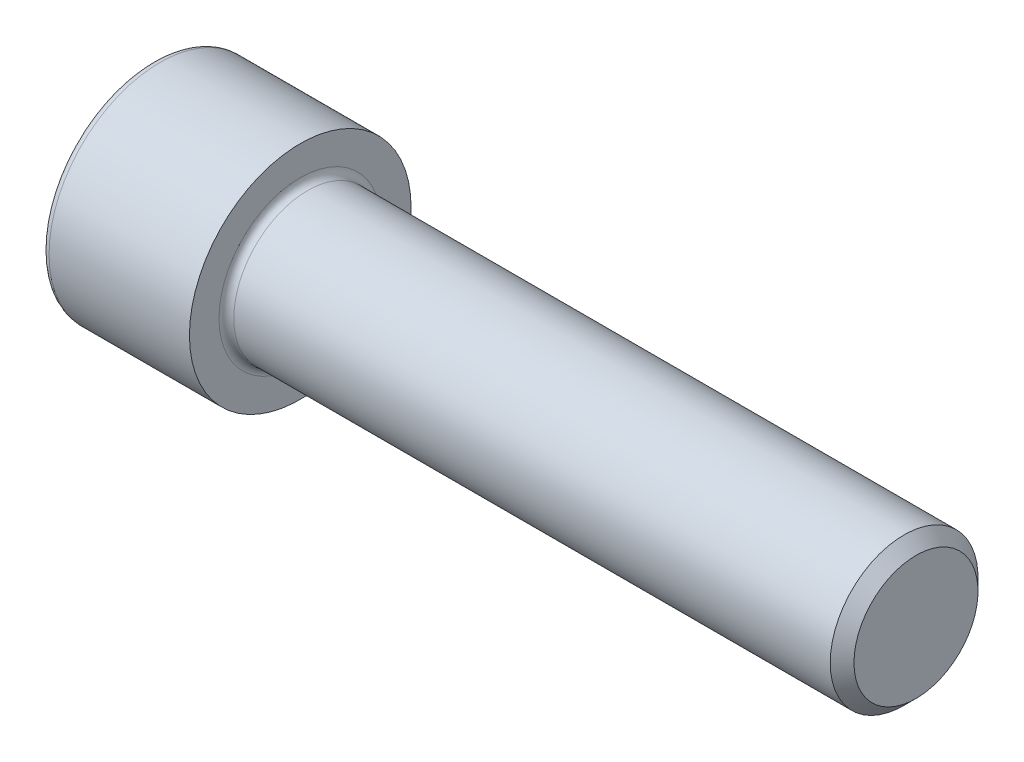
ISO-10303-21;
HEADER;
FILE_DESCRIPTION(('STEP AP214'),'2;1');
FILE_NAME('part.step','',(''),(''),'','','');
FILE_SCHEMA(('AUTOMOTIVE_DESIGN { 1 0 10303 214 1 1 1 1 }'));
ENDSEC;
DATA;
#1=APPLICATION_CONTEXT('core data for automotive mechanical design processes');
#2=APPLICATION_PROTOCOL_DEFINITION('international standard','automotive_design',2000,#1);
#3=PRODUCT_CONTEXT('',#1,'mechanical');
#4=PRODUCT('Part','Part','',(#3));
#5=PRODUCT_RELATED_PRODUCT_CATEGORY('part','',(#4));
#6=PRODUCT_DEFINITION_FORMATION('','',#4);
#7=PRODUCT_DEFINITION_CONTEXT('part definition',#1,'design');
#8=PRODUCT_DEFINITION('design','',#6,#7);
#9=PRODUCT_DEFINITION_SHAPE('','',#8);
#10=(LENGTH_UNIT() NAMED_UNIT(*) SI_UNIT(.MILLI.,.METRE.));
#11=(NAMED_UNIT(*) PLANE_ANGLE_UNIT() SI_UNIT($,.RADIAN.));
#12=(NAMED_UNIT(*) SI_UNIT($,.STERADIAN.) SOLID_ANGLE_UNIT());
#13=UNCERTAINTY_MEASURE_WITH_UNIT(LENGTH_MEASURE(1.E-05),#10,'distance_accuracy_value','');
#14=(GEOMETRIC_REPRESENTATION_CONTEXT(3) GLOBAL_UNCERTAINTY_ASSIGNED_CONTEXT((#13)) GLOBAL_UNIT_ASSIGNED_CONTEXT((#10,
#11,#12)) REPRESENTATION_CONTEXT('',''));
#15=CARTESIAN_POINT('',(0.,0.,0.));
#16=DIRECTION('',(0.,0.,1.));
#17=DIRECTION('',(1.,0.,0.));
#18=AXIS2_PLACEMENT_3D('',#15,#16,#17);
#19=CARTESIAN_POINT('',(6.00000000002865,0.,0.));
#20=DIRECTION('',(-1.,0.,0.));
#21=DIRECTION('',(0.,0.,1.));
#22=AXIS2_PLACEMENT_3D('',#19,#20,#21);
#23=CONICAL_SURFACE('',#22,5.05749999996397,1.04719755119705);
#24=CARTESIAN_POINT('',(8.91994898645976,0.,5.6843418860808E-11));
#25=VERTEX_POINT('',#24);
#26=VERTEX_LOOP('',#25);
#27=FACE_BOUND('',#26,.T.);
#28=CARTESIAN_POINT('',(6.00000000002865,0.,0.));
#29=DIRECTION('',(-1.,0.,0.));
#30=DIRECTION('',(0.,0.,1.));
#31=AXIS2_PLACEMENT_3D('',#28,#29,#30);
#32=CIRCLE('',#31,5.05749999996397);
#33=CARTESIAN_POINT('',(6.00000000001432,-4.37992347962419,2.528749999991));
#34=VERTEX_POINT('',#33);
#35=CARTESIAN_POINT('',(6.00000000000728,0.,5.0575000000014));
#36=VERTEX_POINT('',#35);
#37=EDGE_CURVE('E102',#34,#36,#32,.T.);
#38=ORIENTED_EDGE('',*,*,#37,.T.);
#39=CARTESIAN_POINT('',(6.00000000002865,0.,0.));
#40=DIRECTION('',(-1.,0.,0.));
#41=DIRECTION('',(0.,0.,1.));
#42=AXIS2_PLACEMENT_3D('',#39,#40,#41);
#43=CIRCLE('',#42,5.05749999996396);
#44=CARTESIAN_POINT('',(6.00000000001433,4.37992347962419,2.52874999999099));
#45=VERTEX_POINT('',#44);
#46=EDGE_CURVE('E105',#36,#45,#43,.T.);
#47=ORIENTED_EDGE('',*,*,#46,.T.);
#48=CARTESIAN_POINT('',(6.00000000002865,0.,0.));
#49=DIRECTION('',(-1.,0.,0.));
#50=DIRECTION('',(0.,0.,1.));
#51=AXIS2_PLACEMENT_3D('',#48,#49,#50);
#52=CIRCLE('',#51,5.05749999996397);
#53=CARTESIAN_POINT('',(6.00000000001432,4.37992347962419,-2.528749999991));
#54=VERTEX_POINT('',#53);
#55=EDGE_CURVE('E107',#45,#54,#52,.T.);
#56=ORIENTED_EDGE('',*,*,#55,.T.);
#57=CARTESIAN_POINT('',(6.00000000002865,0.,0.));
#58=DIRECTION('',(-1.,0.,0.));
#59=DIRECTION('',(0.,0.,1.));
#60=AXIS2_PLACEMENT_3D('',#57,#58,#59);
#61=CIRCLE('',#60,5.05749999996397);
#62=CARTESIAN_POINT('',(6.00000000000728,0.,-5.0575000000014));
#63=VERTEX_POINT('',#62);
#64=EDGE_CURVE('E121',#54,#63,#61,.T.);
#65=ORIENTED_EDGE('',*,*,#64,.T.);
#66=CARTESIAN_POINT('',(6.00000000002865,0.,0.));
#67=DIRECTION('',(-1.,0.,0.));
#68=DIRECTION('',(0.,0.,1.));
#69=AXIS2_PLACEMENT_3D('',#66,#67,#68);
#70=CIRCLE('',#69,5.05749999996396);
#71=CARTESIAN_POINT('',(6.00000000001433,-4.3799234796242,-2.52874999999099));
#72=VERTEX_POINT('',#71);
#73=EDGE_CURVE('E122',#63,#72,#70,.T.);
#74=ORIENTED_EDGE('',*,*,#73,.T.);
#75=CARTESIAN_POINT('',(6.00000000002865,0.,0.));
#76=DIRECTION('',(-1.,0.,0.));
#77=DIRECTION('',(0.,0.,1.));
#78=AXIS2_PLACEMENT_3D('',#75,#76,#77);
#79=CIRCLE('',#78,5.05749999996397);
#80=EDGE_CURVE('E230',#72,#34,#79,.T.);
#81=ORIENTED_EDGE('',*,*,#80,.T.);
#82=EDGE_LOOP('',(#38,#47,#56,#65,#74,#81));
#83=FACE_BOUND('',#82,.T.);
#84=ADVANCED_FACE('F17',(#27,#83),#23,.F.);
#85=CARTESIAN_POINT('',(6.,0.,10.115));
#86=DIRECTION('',(1.,0.,0.));
#87=DIRECTION('',(0.,0.,-1.));
#88=AXIS2_PLACEMENT_3D('',#85,#86,#87);
#89=PLANE('',#88);
#90=DIRECTION('',(0.,0.499999999999999,-0.866025403784439));
#91=VECTOR('',#90,1.);
#92=CARTESIAN_POINT('',(6.,5.83989797285306,0.));
#93=LINE('',#92,#91);
#94=CARTESIAN_POINT('',(6.,2.91994898642653,5.05749999999999));
#95=VERTEX_POINT('',#94);
#96=EDGE_CURVE('E125',#45,#95,#93,.F.);
#97=ORIENTED_EDGE('',*,*,#96,.F.);
#98=ORIENTED_EDGE('',*,*,#46,.F.);
#99=DIRECTION('',(0.,-1.,0.));
#100=VECTOR('',#99,1.);
#101=CARTESIAN_POINT('',(6.,-2.91994898642653,5.0575));
#102=LINE('',#101,#100);
#103=EDGE_CURVE('E127',#36,#95,#102,.F.);
#104=ORIENTED_EDGE('',*,*,#103,.T.);
#105=EDGE_LOOP('',(#97,#98,#104));
#106=FACE_BOUND('',#105,.T.);
#107=ADVANCED_FACE('F126',(#106),#89,.F.);
#108=CARTESIAN_POINT('',(6.,0.,10.115));
#109=DIRECTION('',(1.,0.,0.));
#110=DIRECTION('',(0.,0.,-1.));
#111=AXIS2_PLACEMENT_3D('',#108,#109,#110);
#112=PLANE('',#111);
#113=DIRECTION('',(0.,-1.,0.));
#114=VECTOR('',#113,1.);
#115=CARTESIAN_POINT('',(6.,-2.91994898642653,5.0575));
#116=LINE('',#115,#114);
#117=CARTESIAN_POINT('',(6.,-2.91994898642653,5.0575));
#118=VERTEX_POINT('',#117);
#119=EDGE_CURVE('E130',#118,#36,#116,.F.);
#120=ORIENTED_EDGE('',*,*,#119,.T.);
#121=ORIENTED_EDGE('',*,*,#37,.F.);
#122=DIRECTION('',(0.,0.500000000000001,0.866025403784438));
#123=VECTOR('',#122,1.);
#124=CARTESIAN_POINT('',(6.,-2.91994898642653,5.0575));
#125=LINE('',#124,#123);
#126=EDGE_CURVE('E183',#118,#34,#125,.F.);
#127=ORIENTED_EDGE('',*,*,#126,.F.);
#128=EDGE_LOOP('',(#120,#121,#127));
#129=FACE_BOUND('',#128,.T.);
#130=ADVANCED_FACE('F490',(#129),#112,.F.);
#131=CARTESIAN_POINT('',(6.,0.,10.115));
#132=DIRECTION('',(1.,0.,0.));
#133=DIRECTION('',(0.,0.,-1.));
#134=AXIS2_PLACEMENT_3D('',#131,#132,#133);
#135=PLANE('',#134);
#136=DIRECTION('',(0.,0.500000000000001,0.866025403784438));
#137=VECTOR('',#136,1.);
#138=CARTESIAN_POINT('',(6.,-2.91994898642653,5.0575));
#139=LINE('',#138,#137);
#140=CARTESIAN_POINT('',(6.,-5.83989797285307,0.));
#141=VERTEX_POINT('',#140);
#142=EDGE_CURVE('E179',#34,#141,#139,.F.);
#143=ORIENTED_EDGE('',*,*,#142,.F.);
#144=ORIENTED_EDGE('',*,*,#80,.F.);
#145=DIRECTION('',(0.,-0.499999999999999,0.866025403784439));
#146=VECTOR('',#145,1.);
#147=CARTESIAN_POINT('',(6.,-5.83989797285307,0.));
#148=LINE('',#147,#146);
#149=EDGE_CURVE('E166',#141,#72,#148,.F.);
#150=ORIENTED_EDGE('',*,*,#149,.F.);
#151=EDGE_LOOP('',(#143,#144,#150));
#152=FACE_BOUND('',#151,.T.);
#153=ADVANCED_FACE('F482',(#152),#135,.F.);
#154=CARTESIAN_POINT('',(6.,0.,10.115));
#155=DIRECTION('',(1.,0.,0.));
#156=DIRECTION('',(0.,0.,-1.));
#157=AXIS2_PLACEMENT_3D('',#154,#155,#156);
#158=PLANE('',#157);
#159=DIRECTION('',(0.,-0.499999999999999,0.866025403784439));
#160=VECTOR('',#159,1.);
#161=CARTESIAN_POINT('',(6.,-5.83989797285307,0.));
#162=LINE('',#161,#160);
#163=CARTESIAN_POINT('',(6.,-2.91994898642654,-5.0575));
#164=VERTEX_POINT('',#163);
#165=EDGE_CURVE('E163',#72,#164,#162,.F.);
#166=ORIENTED_EDGE('',*,*,#165,.F.);
#167=ORIENTED_EDGE('',*,*,#73,.F.);
#168=DIRECTION('',(0.,1.,0.));
#169=VECTOR('',#168,1.);
#170=CARTESIAN_POINT('',(6.,2.91994898642652,-5.0575));
#171=LINE('',#170,#169);
#172=EDGE_CURVE('E157',#63,#164,#171,.F.);
#173=ORIENTED_EDGE('',*,*,#172,.T.);
#174=EDGE_LOOP('',(#166,#167,#173));
#175=FACE_BOUND('',#174,.T.);
#176=ADVANCED_FACE('F475',(#175),#158,.F.);
#177=CARTESIAN_POINT('',(6.,0.,10.115));
#178=DIRECTION('',(1.,0.,0.));
#179=DIRECTION('',(0.,0.,-1.));
#180=AXIS2_PLACEMENT_3D('',#177,#178,#179);
#181=PLANE('',#180);
#182=DIRECTION('',(0.,0.500000000000001,0.866025403784438));
#183=VECTOR('',#182,1.);
#184=CARTESIAN_POINT('',(6.,5.83989797285306,0.));
#185=LINE('',#184,#183);
#186=CARTESIAN_POINT('',(6.,5.83989797285306,0.));
#187=VERTEX_POINT('',#186);
#188=EDGE_CURVE('E119',#187,#54,#185,.F.);
#189=ORIENTED_EDGE('',*,*,#188,.T.);
#190=ORIENTED_EDGE('',*,*,#55,.F.);
#191=DIRECTION('',(0.,0.499999999999999,-0.866025403784439));
#192=VECTOR('',#191,1.);
#193=CARTESIAN_POINT('',(6.,5.83989797285306,0.));
#194=LINE('',#193,#192);
#195=EDGE_CURVE('E116',#187,#45,#194,.F.);
#196=ORIENTED_EDGE('',*,*,#195,.F.);
#197=EDGE_LOOP('',(#189,#190,#196));
#198=FACE_BOUND('',#197,.T.);
#199=ADVANCED_FACE('F114',(#198),#181,.F.);
#200=CARTESIAN_POINT('',(6.,0.,10.115));
#201=DIRECTION('',(1.,0.,0.));
#202=DIRECTION('',(0.,0.,-1.));
#203=AXIS2_PLACEMENT_3D('',#200,#201,#202);
#204=PLANE('',#203);
#205=DIRECTION('',(0.,1.,0.));
#206=VECTOR('',#205,1.);
#207=CARTESIAN_POINT('',(6.,2.91994898642652,-5.0575));
#208=LINE('',#207,#206);
#209=CARTESIAN_POINT('',(6.,2.91994898642652,-5.0575));
#210=VERTEX_POINT('',#209);
#211=EDGE_CURVE('E160',#210,#63,#208,.F.);
#212=ORIENTED_EDGE('',*,*,#211,.T.);
#213=ORIENTED_EDGE('',*,*,#64,.F.);
#214=DIRECTION('',(0.,0.500000000000001,0.866025403784438));
#215=VECTOR('',#214,1.);
#216=CARTESIAN_POINT('',(6.,5.83989797285306,0.));
#217=LINE('',#216,#215);
#218=EDGE_CURVE('E317',#54,#210,#217,.F.);
#219=ORIENTED_EDGE('',*,*,#218,.T.);
#220=EDGE_LOOP('',(#212,#213,#219));
#221=FACE_BOUND('',#220,.T.);
#222=ADVANCED_FACE('F461',(#221),#204,.F.);
#223=CARTESIAN_POINT('',(6.,5.83989797285306,0.));
#224=DIRECTION('',(0.,-0.866025403784439,-0.499999999999999));
#225=DIRECTION('',(0.,0.499999999999999,-0.866025403784439));
#226=AXIS2_PLACEMENT_3D('',#223,#224,#225);
#227=PLANE('',#226);
#228=ORIENTED_EDGE('',*,*,#96,.T.);
#229=DIRECTION('',(1.,0.,0.));
#230=VECTOR('',#229,1.);
#231=CARTESIAN_POINT('',(6.,2.91994898642653,5.05749999999999));
#232=LINE('',#231,#230);
#233=CARTESIAN_POINT('',(0.,2.91994898642653,5.05749999999999));
#234=VERTEX_POINT('',#233);
#235=EDGE_CURVE('E203',#95,#234,#232,.F.);
#236=ORIENTED_EDGE('',*,*,#235,.T.);
#237=DIRECTION('',(0.,-0.499999999999999,0.866025403784439));
#238=VECTOR('',#237,1.);
#239=CARTESIAN_POINT('',(0.,5.83989797285306,0.));
#240=LINE('',#239,#238);
#241=CARTESIAN_POINT('',(0.,5.83989797285306,0.));
#242=VERTEX_POINT('',#241);
#243=EDGE_CURVE('E143',#242,#234,#240,.T.);
#244=ORIENTED_EDGE('',*,*,#243,.F.);
#245=DIRECTION('',(1.,0.,0.));
#246=VECTOR('',#245,1.);
#247=CARTESIAN_POINT('',(6.,5.83989797285306,0.));
#248=LINE('',#247,#246);
#249=EDGE_CURVE('E134',#242,#187,#248,.T.);
#250=ORIENTED_EDGE('',*,*,#249,.T.);
#251=ORIENTED_EDGE('',*,*,#195,.T.);
#252=EDGE_LOOP('',(#228,#236,#244,#250,#251));
#253=FACE_BOUND('',#252,.T.);
#254=ADVANCED_FACE('F132',(#253),#227,.T.);
#255=CARTESIAN_POINT('',(6.,-2.91994898642653,5.0575));
#256=DIRECTION('',(0.,0.,1.));
#257=DIRECTION('',(0.,-1.,0.));
#258=AXIS2_PLACEMENT_3D('',#255,#256,#257);
#259=PLANE('',#258);
#260=ORIENTED_EDGE('',*,*,#235,.F.);
#261=ORIENTED_EDGE('',*,*,#103,.F.);
#262=ORIENTED_EDGE('',*,*,#119,.F.);
#263=DIRECTION('',(1.,0.,0.));
#264=VECTOR('',#263,1.);
#265=CARTESIAN_POINT('',(6.,-2.91994898642653,5.0575));
#266=LINE('',#265,#264);
#267=CARTESIAN_POINT('',(0.,-2.91994898642653,5.0575));
#268=VERTEX_POINT('',#267);
#269=EDGE_CURVE('E198',#268,#118,#266,.T.);
#270=ORIENTED_EDGE('',*,*,#269,.F.);
#271=DIRECTION('',(0.,1.,0.));
#272=VECTOR('',#271,1.);
#273=CARTESIAN_POINT('',(0.,0.,5.05749999999999));
#274=LINE('',#273,#272);
#275=EDGE_CURVE('E146',#234,#268,#274,.F.);
#276=ORIENTED_EDGE('',*,*,#275,.F.);
#277=EDGE_LOOP('',(#260,#261,#262,#270,#276));
#278=FACE_BOUND('',#277,.T.);
#279=ADVANCED_FACE('F446',(#278),#259,.F.);
#280=CARTESIAN_POINT('',(6.,-2.91994898642653,5.0575));
#281=DIRECTION('',(0.,0.866025403784438,-0.500000000000001));
#282=DIRECTION('',(0.,0.500000000000001,0.866025403784438));
#283=AXIS2_PLACEMENT_3D('',#280,#281,#282);
#284=PLANE('',#283);
#285=ORIENTED_EDGE('',*,*,#142,.T.);
#286=DIRECTION('',(1.,0.,0.));
#287=VECTOR('',#286,1.);
#288=CARTESIAN_POINT('',(6.,-5.83989797285307,0.));
#289=LINE('',#288,#287);
#290=CARTESIAN_POINT('',(0.,-5.83989797285307,0.));
#291=VERTEX_POINT('',#290);
#292=EDGE_CURVE('E174',#291,#141,#289,.T.);
#293=ORIENTED_EDGE('',*,*,#292,.F.);
#294=DIRECTION('',(0.,-0.500000000000001,-0.866025403784438));
#295=VECTOR('',#294,1.);
#296=CARTESIAN_POINT('',(0.,-2.91994898642653,5.0575));
#297=LINE('',#296,#295);
#298=EDGE_CURVE('E189',#268,#291,#297,.T.);
#299=ORIENTED_EDGE('',*,*,#298,.F.);
#300=ORIENTED_EDGE('',*,*,#269,.T.);
#301=ORIENTED_EDGE('',*,*,#126,.T.);
#302=EDGE_LOOP('',(#285,#293,#299,#300,#301));
#303=FACE_BOUND('',#302,.T.);
#304=ADVANCED_FACE('F438',(#303),#284,.T.);
#305=CARTESIAN_POINT('',(6.,-5.83989797285307,0.));
#306=DIRECTION('',(0.,0.866025403784439,0.499999999999999));
#307=DIRECTION('',(0.,-0.499999999999999,0.866025403784439));
#308=AXIS2_PLACEMENT_3D('',#305,#306,#307);
#309=PLANE('',#308);
#310=ORIENTED_EDGE('',*,*,#165,.T.);
#311=DIRECTION('',(1.,0.,0.));
#312=VECTOR('',#311,1.);
#313=CARTESIAN_POINT('',(6.,-2.91994898642654,-5.0575));
#314=LINE('',#313,#312);
#315=CARTESIAN_POINT('',(0.,-2.91994898642654,-5.0575));
#316=VERTEX_POINT('',#315);
#317=EDGE_CURVE('E159',#164,#316,#314,.F.);
#318=ORIENTED_EDGE('',*,*,#317,.T.);
#319=DIRECTION('',(0.,0.499999999999999,-0.866025403784439));
#320=VECTOR('',#319,1.);
#321=CARTESIAN_POINT('',(0.,-5.83989797285307,0.));
#322=LINE('',#321,#320);
#323=EDGE_CURVE('E186',#291,#316,#322,.T.);
#324=ORIENTED_EDGE('',*,*,#323,.F.);
#325=ORIENTED_EDGE('',*,*,#292,.T.);
#326=ORIENTED_EDGE('',*,*,#149,.T.);
#327=EDGE_LOOP('',(#310,#318,#324,#325,#326));
#328=FACE_BOUND('',#327,.T.);
#329=ADVANCED_FACE('F431',(#328),#309,.T.);
#330=CARTESIAN_POINT('',(6.,2.91994898642652,-5.0575));
#331=DIRECTION('',(0.,0.,-1.));
#332=DIRECTION('',(0.,1.,0.));
#333=AXIS2_PLACEMENT_3D('',#330,#331,#332);
#334=PLANE('',#333);
#335=ORIENTED_EDGE('',*,*,#317,.F.);
#336=ORIENTED_EDGE('',*,*,#172,.F.);
#337=ORIENTED_EDGE('',*,*,#211,.F.);
#338=DIRECTION('',(1.,0.,0.));
#339=VECTOR('',#338,1.);
#340=CARTESIAN_POINT('',(6.,2.91994898642652,-5.0575));
#341=LINE('',#340,#339);
#342=CARTESIAN_POINT('',(0.,2.91994898642652,-5.0575));
#343=VERTEX_POINT('',#342);
#344=EDGE_CURVE('E147',#210,#343,#341,.F.);
#345=ORIENTED_EDGE('',*,*,#344,.T.);
#346=DIRECTION('',(0.,1.,0.));
#347=VECTOR('',#346,1.);
#348=CARTESIAN_POINT('',(0.,0.,-5.0575));
#349=LINE('',#348,#347);
#350=EDGE_CURVE('E154',#316,#343,#349,.T.);
#351=ORIENTED_EDGE('',*,*,#350,.F.);
#352=EDGE_LOOP('',(#335,#336,#337,#345,#351));
#353=FACE_BOUND('',#352,.T.);
#354=ADVANCED_FACE('F335',(#353),#334,.F.);
#355=CARTESIAN_POINT('',(6.,5.83989797285306,0.));
#356=DIRECTION('',(0.,0.866025403784438,-0.500000000000001));
#357=DIRECTION('',(0.,0.500000000000001,0.866025403784438));
#358=AXIS2_PLACEMENT_3D('',#355,#356,#357);
#359=PLANE('',#358);
#360=ORIENTED_EDGE('',*,*,#344,.F.);
#361=ORIENTED_EDGE('',*,*,#218,.F.);
#362=ORIENTED_EDGE('',*,*,#188,.F.);
#363=ORIENTED_EDGE('',*,*,#249,.F.);
#364=DIRECTION('',(0.,0.500000000000001,0.866025403784438));
#365=VECTOR('',#364,1.);
#366=CARTESIAN_POINT('',(0.,2.91994898642652,-5.0575));
#367=LINE('',#366,#365);
#368=EDGE_CURVE('E150',#343,#242,#367,.T.);
#369=ORIENTED_EDGE('',*,*,#368,.F.);
#370=EDGE_LOOP('',(#360,#361,#362,#363,#369));
#371=FACE_BOUND('',#370,.T.);
#372=ADVANCED_FACE('F340',(#371),#359,.F.);
#373=CARTESIAN_POINT('',(0.,0.,0.));
#374=DIRECTION('',(-1.,0.,0.));
#375=DIRECTION('',(0.,0.,1.));
#376=AXIS2_PLACEMENT_3D('',#373,#374,#375);
#377=PLANE('',#376);
#378=CARTESIAN_POINT('',(0.,0.,0.));
#379=DIRECTION('',(1.,0.,0.));
#380=DIRECTION('',(0.,0.,-1.));
#381=AXIS2_PLACEMENT_3D('',#378,#379,#380);
#382=CIRCLE('',#381,8.4);
#383=CARTESIAN_POINT('',(0.,0.,-8.4));
#384=VERTEX_POINT('',#383);
#385=CARTESIAN_POINT('',(0.,0.,8.4));
#386=VERTEX_POINT('',#385);
#387=EDGE_CURVE('E153',#384,#386,#382,.T.);
#388=ORIENTED_EDGE('',*,*,#387,.F.);
#389=CARTESIAN_POINT('',(0.,0.,0.));
#390=DIRECTION('',(1.,0.,0.));
#391=DIRECTION('',(0.,0.,1.));
#392=AXIS2_PLACEMENT_3D('',#389,#390,#391);
#393=CIRCLE('',#392,8.4);
#394=EDGE_CURVE('E355',#386,#384,#393,.T.);
#395=ORIENTED_EDGE('',*,*,#394,.F.);
#396=EDGE_LOOP('',(#388,#395));
#397=FACE_BOUND('',#396,.T.);
#398=ORIENTED_EDGE('',*,*,#350,.T.);
#399=ORIENTED_EDGE('',*,*,#368,.T.);
#400=ORIENTED_EDGE('',*,*,#243,.T.);
#401=ORIENTED_EDGE('',*,*,#275,.T.);
#402=ORIENTED_EDGE('',*,*,#298,.T.);
#403=ORIENTED_EDGE('',*,*,#323,.T.);
#404=EDGE_LOOP('',(#398,#399,#400,#401,#402,#403));
#405=FACE_BOUND('',#404,.T.);
#406=ADVANCED_FACE('F299',(#397,#405),#377,.T.);
#407=CARTESIAN_POINT('',(0.600000000000003,0.,0.));
#408=DIRECTION('',(-1.,0.,0.));
#409=DIRECTION('',(0.,0.,1.));
#410=AXIS2_PLACEMENT_3D('',#407,#408,#409);
#411=TOROIDAL_SURFACE('',#410,8.4,0.6);
#412=CARTESIAN_POINT('',(0.600000000000003,0.,0.));
#413=DIRECTION('',(-1.,0.,0.));
#414=DIRECTION('',(0.,0.,1.));
#415=AXIS2_PLACEMENT_3D('',#412,#413,#414);
#416=CIRCLE('',#415,9.);
#417=CARTESIAN_POINT('',(0.600000000000003,0.,9.));
#418=VERTEX_POINT('',#417);
#419=EDGE_CURVE('E227',#418,#418,#416,.F.);
#420=ORIENTED_EDGE('',*,*,#419,.F.);
#421=EDGE_LOOP('',(#420));
#422=FACE_BOUND('',#421,.T.);
#423=ORIENTED_EDGE('',*,*,#394,.T.);
#424=ORIENTED_EDGE('',*,*,#387,.T.);
#425=EDGE_LOOP('',(#423,#424));
#426=FACE_BOUND('',#425,.T.);
#427=ADVANCED_FACE('F294',(#422,#426),#411,.T.);
#428=CARTESIAN_POINT('',(-31.75,0.,0.));
#429=DIRECTION('',(-1.,0.,0.));
#430=DIRECTION('',(0.,0.,1.));
#431=AXIS2_PLACEMENT_3D('',#428,#429,#430);
#432=CYLINDRICAL_SURFACE('',#431,9.);
#433=CARTESIAN_POINT('',(12.,0.,0.));
#434=DIRECTION('',(-1.,0.,0.));
#435=DIRECTION('',(0.,0.,1.));
#436=AXIS2_PLACEMENT_3D('',#433,#434,#435);
#437=CIRCLE('',#436,9.);
#438=CARTESIAN_POINT('',(12.,0.,9.));
#439=VERTEX_POINT('',#438);
#440=EDGE_CURVE('E225',#439,#439,#437,.F.);
#441=ORIENTED_EDGE('',*,*,#440,.F.);
#442=EDGE_LOOP('',(#441));
#443=FACE_BOUND('',#442,.T.);
#444=ORIENTED_EDGE('',*,*,#419,.T.);
#445=EDGE_LOOP('',(#444));
#446=FACE_BOUND('',#445,.T.);
#447=ADVANCED_FACE('F298',(#443,#446),#432,.T.);
#448=CARTESIAN_POINT('',(62.,5.036,0.));
#449=DIRECTION('',(1.,0.,0.));
#450=DIRECTION('',(0.,0.,-1.));
#451=AXIS2_PLACEMENT_3D('',#448,#449,#450);
#452=PLANE('',#451);
#453=CARTESIAN_POINT('',(62.0000000000118,0.,0.));
#454=DIRECTION('',(-1.,0.,0.));
#455=DIRECTION('',(0.,0.,1.));
#456=AXIS2_PLACEMENT_3D('',#453,#454,#455);
#457=CIRCLE('',#456,5.0359999999614);
#458=CARTESIAN_POINT('',(62.0000000000118,0.,5.0359999999614));
#459=VERTEX_POINT('',#458);
#460=EDGE_CURVE('E221',#459,#459,#457,.T.);
#461=ORIENTED_EDGE('',*,*,#460,.F.);
#462=EDGE_LOOP('',(#461));
#463=FACE_BOUND('',#462,.T.);
#464=ADVANCED_FACE('F271',(#463),#452,.T.);
#465=CARTESIAN_POINT('',(12.,9.,0.));
#466=DIRECTION('',(1.,0.,0.));
#467=DIRECTION('',(0.,0.,-1.));
#468=AXIS2_PLACEMENT_3D('',#465,#466,#467);
#469=PLANE('',#468);
#470=ORIENTED_EDGE('',*,*,#440,.T.);
#471=EDGE_LOOP('',(#470));
#472=FACE_BOUND('',#471,.T.);
#473=CARTESIAN_POINT('',(12.,0.,0.));
#474=DIRECTION('',(1.,0.,0.));
#475=DIRECTION('',(0.,0.,1.));
#476=AXIS2_PLACEMENT_3D('',#473,#474,#475);
#477=CIRCLE('',#476,6.59999999999995);
#478=CARTESIAN_POINT('',(12.,0.,-6.59999999999996));
#479=VERTEX_POINT('',#478);
#480=CARTESIAN_POINT('',(12.,0.,6.59999999999996));
#481=VERTEX_POINT('',#480);
#482=EDGE_CURVE('E224',#479,#481,#477,.F.);
#483=ORIENTED_EDGE('',*,*,#482,.T.);
#484=CARTESIAN_POINT('',(12.,0.,0.));
#485=DIRECTION('',(1.,0.,0.));
#486=DIRECTION('',(0.,0.,-1.));
#487=AXIS2_PLACEMENT_3D('',#484,#485,#486);
#488=CIRCLE('',#487,6.59999999999995);
#489=EDGE_CURVE('E36',#481,#479,#488,.F.);
#490=ORIENTED_EDGE('',*,*,#489,.T.);
#491=EDGE_LOOP('',(#483,#490));
#492=FACE_BOUND('',#491,.T.);
#493=ADVANCED_FACE('F262',(#472,#492),#469,.T.);
#494=CARTESIAN_POINT('',(61.0359999999446,0.,0.));
#495=DIRECTION('',(-1.,0.,0.));
#496=DIRECTION('',(0.,0.,1.));
#497=AXIS2_PLACEMENT_3D('',#494,#495,#496);
#498=CONICAL_SURFACE('',#497,6.00000000002865,0.785398163397448);
#499=CARTESIAN_POINT('',(61.0359999999999,0.,0.));
#500=DIRECTION('',(-1.,0.,0.));
#501=DIRECTION('',(0.,0.,1.));
#502=AXIS2_PLACEMENT_3D('',#499,#500,#501);
#503=CIRCLE('',#502,5.99999999999995);
#504=CARTESIAN_POINT('',(61.0359999999999,0.,5.99999999999995));
#505=VERTEX_POINT('',#504);
#506=EDGE_CURVE('E28',#505,#505,#503,.T.);
#507=ORIENTED_EDGE('',*,*,#506,.F.);
#508=EDGE_LOOP('',(#507));
#509=FACE_BOUND('',#508,.T.);
#510=ORIENTED_EDGE('',*,*,#460,.T.);
#511=EDGE_LOOP('',(#510));
#512=FACE_BOUND('',#511,.T.);
#513=ADVANCED_FACE('F250',(#509,#512),#498,.T.);
#514=CARTESIAN_POINT('',(12.6,0.,0.));
#515=DIRECTION('',(1.,0.,0.));
#516=DIRECTION('',(0.,0.,-1.));
#517=AXIS2_PLACEMENT_3D('',#514,#515,#516);
#518=TOROIDAL_SURFACE('',#517,6.59999999999995,0.6);
#519=CARTESIAN_POINT('',(12.6,0.,0.));
#520=DIRECTION('',(-1.,0.,0.));
#521=DIRECTION('',(0.,0.,1.));
#522=AXIS2_PLACEMENT_3D('',#519,#520,#521);
#523=CIRCLE('',#522,5.99999999999995);
#524=CARTESIAN_POINT('',(12.6,0.,5.99999999999995));
#525=VERTEX_POINT('',#524);
#526=EDGE_CURVE('E11',#525,#525,#523,.F.);
#527=ORIENTED_EDGE('',*,*,#526,.F.);
#528=EDGE_LOOP('',(#527));
#529=FACE_BOUND('',#528,.T.);
#530=ORIENTED_EDGE('',*,*,#482,.F.);
#531=ORIENTED_EDGE('',*,*,#489,.F.);
#532=EDGE_LOOP('',(#530,#531));
#533=FACE_BOUND('',#532,.T.);
#534=ADVANCED_FACE('F238',(#529,#533),#518,.F.);
#535=CARTESIAN_POINT('',(-31.75,0.,0.));
#536=DIRECTION('',(-1.,0.,0.));
#537=DIRECTION('',(0.,0.,1.));
#538=AXIS2_PLACEMENT_3D('',#535,#536,#537);
#539=CYLINDRICAL_SURFACE('',#538,5.99999999999995);
#540=ORIENTED_EDGE('',*,*,#526,.T.);
#541=EDGE_LOOP('',(#540));
#542=FACE_BOUND('',#541,.T.);
#543=ORIENTED_EDGE('',*,*,#506,.T.);
#544=EDGE_LOOP('',(#543));
#545=FACE_BOUND('',#544,.T.);
#546=ADVANCED_FACE('F249',(#542,#545),#539,.T.);
#547=CLOSED_SHELL('',(#84,#107,#130,#153,#176,#199,#222,#254,#279,#304,#329,#354,#372,#406,#427,
#447,#464,#493,#513,#534,#546));
#548=MANIFOLD_SOLID_BREP('B1',#547);
#549=ADVANCED_BREP_SHAPE_REPRESENTATION('',(#18,#548),#14);
#550=SHAPE_DEFINITION_REPRESENTATION(#9,#549);
ENDSEC;
END-ISO-10303-21;
